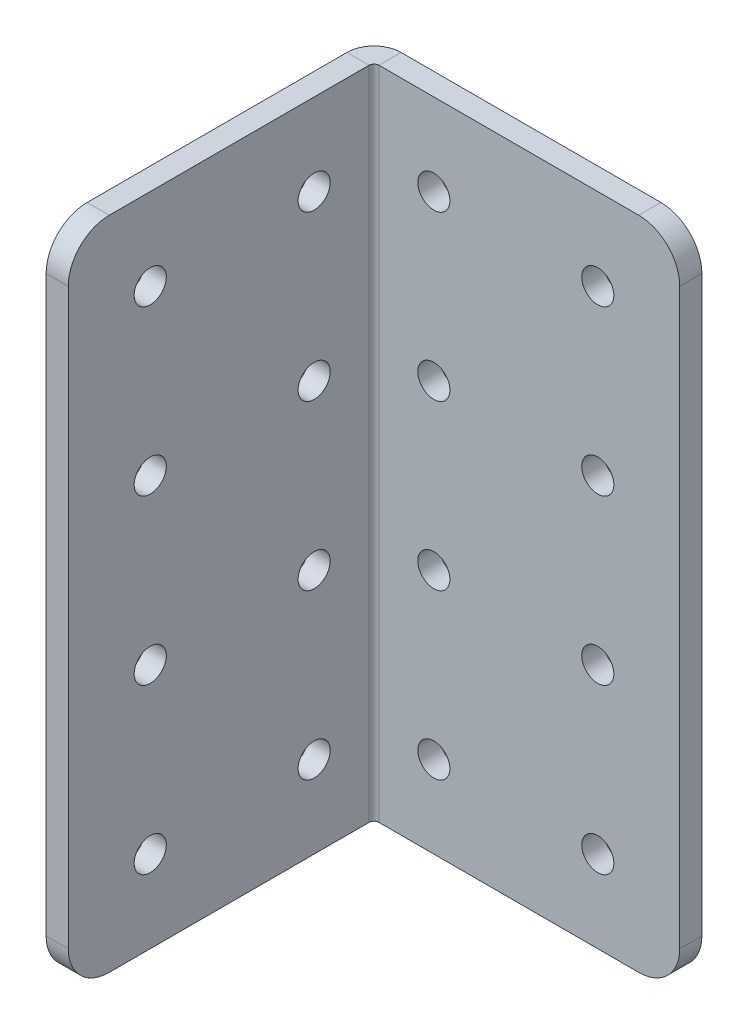
ISO-10303-21;
HEADER;
FILE_DESCRIPTION(('STEP AP214'),'2;1');
FILE_NAME('part.step','',(''),(''),'','','');
FILE_SCHEMA(('AUTOMOTIVE_DESIGN { 1 0 10303 214 1 1 1 1 }'));
ENDSEC;
DATA;
#1=APPLICATION_CONTEXT('core data for automotive mechanical design processes');
#2=APPLICATION_PROTOCOL_DEFINITION('international standard','automotive_design',2000,#1);
#3=PRODUCT_CONTEXT('',#1,'mechanical');
#4=PRODUCT('Part','Part','',(#3));
#5=PRODUCT_RELATED_PRODUCT_CATEGORY('part','',(#4));
#6=PRODUCT_DEFINITION_FORMATION('','',#4);
#7=PRODUCT_DEFINITION_CONTEXT('part definition',#1,'design');
#8=PRODUCT_DEFINITION('design','',#6,#7);
#9=PRODUCT_DEFINITION_SHAPE('','',#8);
#10=(LENGTH_UNIT() NAMED_UNIT(*) SI_UNIT(.MILLI.,.METRE.));
#11=(NAMED_UNIT(*) PLANE_ANGLE_UNIT() SI_UNIT($,.RADIAN.));
#12=(NAMED_UNIT(*) SI_UNIT($,.STERADIAN.) SOLID_ANGLE_UNIT());
#13=UNCERTAINTY_MEASURE_WITH_UNIT(LENGTH_MEASURE(1.E-05),#10,'distance_accuracy_value','');
#14=(GEOMETRIC_REPRESENTATION_CONTEXT(3) GLOBAL_UNCERTAINTY_ASSIGNED_CONTEXT((#13)) GLOBAL_UNIT_ASSIGNED_CONTEXT((#10,
#11,#12)) REPRESENTATION_CONTEXT('',''));
#15=CARTESIAN_POINT('',(0.,0.,0.));
#16=DIRECTION('',(0.,0.,1.));
#17=DIRECTION('',(1.,0.,0.));
#18=AXIS2_PLACEMENT_3D('',#15,#16,#17);
#19=CARTESIAN_POINT('',(4.191,101.6,0.));
#20=DIRECTION('',(0.,1.,0.));
#21=DIRECTION('',(0.,0.,1.));
#22=AXIS2_PLACEMENT_3D('',#19,#20,#21);
#23=PLANE('',#22);
#24=DIRECTION('',(0.,0.,1.));
#25=VECTOR('',#24,1.);
#26=CARTESIAN_POINT('',(4.191,101.6,0.));
#27=LINE('',#26,#25);
#28=CARTESIAN_POINT('',(4.191,101.6,0.));
#29=VERTEX_POINT('',#28);
#30=CARTESIAN_POINT('',(4.191,101.6,3.429));
#31=VERTEX_POINT('',#30);
#32=EDGE_CURVE('E136',#29,#31,#27,.T.);
#33=ORIENTED_EDGE('',*,*,#32,.F.);
#34=CARTESIAN_POINT('',(4.191,101.6,4.191));
#35=DIRECTION('',(0.,1.,0.));
#36=DIRECTION('',(0.,0.,1.));
#37=AXIS2_PLACEMENT_3D('',#34,#35,#36);
#38=CIRCLE('',#37,4.191);
#39=CARTESIAN_POINT('',(0.,101.6,4.191));
#40=VERTEX_POINT('',#39);
#41=EDGE_CURVE('E140',#40,#29,#38,.F.);
#42=ORIENTED_EDGE('',*,*,#41,.F.);
#43=DIRECTION('',(-1.,0.,0.));
#44=VECTOR('',#43,1.);
#45=CARTESIAN_POINT('',(3.429,101.6,4.191));
#46=LINE('',#45,#44);
#47=CARTESIAN_POINT('',(3.429,101.6,4.191));
#48=VERTEX_POINT('',#47);
#49=EDGE_CURVE('E145',#48,#40,#46,.T.);
#50=ORIENTED_EDGE('',*,*,#49,.F.);
#51=CARTESIAN_POINT('',(4.191,101.6,4.191));
#52=DIRECTION('',(0.,1.,0.));
#53=DIRECTION('',(1.,0.,0.));
#54=AXIS2_PLACEMENT_3D('',#51,#52,#53);
#55=CIRCLE('',#54,0.762);
#56=EDGE_CURVE('E142',#48,#31,#55,.F.);
#57=ORIENTED_EDGE('',*,*,#56,.T.);
#58=EDGE_LOOP('',(#33,#42,#50,#57));
#59=FACE_BOUND('',#58,.T.);
#60=ADVANCED_FACE('F45',(#59),#23,.T.);
#61=CARTESIAN_POINT('',(3.429,101.6,4.191));
#62=DIRECTION('',(0.,1.,0.));
#63=DIRECTION('',(0.,0.,1.));
#64=AXIS2_PLACEMENT_3D('',#61,#62,#63);
#65=PLANE('',#64);
#66=DIRECTION('',(1.,0.,0.));
#67=VECTOR('',#66,1.);
#68=CARTESIAN_POINT('',(0.,101.6,3.429));
#69=LINE('',#68,#67);
#70=CARTESIAN_POINT('',(44.45,101.6,3.429));
#71=VERTEX_POINT('',#70);
#72=EDGE_CURVE('E163',#31,#71,#69,.T.);
#73=ORIENTED_EDGE('',*,*,#72,.T.);
#74=DIRECTION('',(0.,0.,1.));
#75=VECTOR('',#74,1.);
#76=CARTESIAN_POINT('',(44.45,101.6,4.191));
#77=LINE('',#76,#75);
#78=CARTESIAN_POINT('',(44.45,101.6,0.));
#79=VERTEX_POINT('',#78);
#80=EDGE_CURVE('E53',#71,#79,#77,.F.);
#81=ORIENTED_EDGE('',*,*,#80,.T.);
#82=DIRECTION('',(1.,0.,0.));
#83=VECTOR('',#82,1.);
#84=CARTESIAN_POINT('',(0.,101.6,0.));
#85=LINE('',#84,#83);
#86=EDGE_CURVE('E152',#29,#79,#85,.T.);
#87=ORIENTED_EDGE('',*,*,#86,.F.);
#88=ORIENTED_EDGE('',*,*,#32,.T.);
#89=EDGE_LOOP('',(#73,#81,#87,#88));
#90=FACE_BOUND('',#89,.T.);
#91=ADVANCED_FACE('F162',(#90),#65,.T.);
#92=CARTESIAN_POINT('',(0.,0.,4.191));
#93=DIRECTION('',(0.,-1.,0.));
#94=DIRECTION('',(0.,0.,-1.));
#95=AXIS2_PLACEMENT_3D('',#92,#93,#94);
#96=PLANE('',#95);
#97=DIRECTION('',(1.,0.,0.));
#98=VECTOR('',#97,1.);
#99=CARTESIAN_POINT('',(0.,0.,4.191));
#100=LINE('',#99,#98);
#101=CARTESIAN_POINT('',(0.,0.,4.191));
#102=VERTEX_POINT('',#101);
#103=CARTESIAN_POINT('',(3.429,0.,4.191));
#104=VERTEX_POINT('',#103);
#105=EDGE_CURVE('E208',#102,#104,#100,.T.);
#106=ORIENTED_EDGE('',*,*,#105,.F.);
#107=CARTESIAN_POINT('',(4.191,0.,4.191));
#108=DIRECTION('',(0.,1.,0.));
#109=DIRECTION('',(0.,0.,1.));
#110=AXIS2_PLACEMENT_3D('',#107,#108,#109);
#111=CIRCLE('',#110,4.191);
#112=CARTESIAN_POINT('',(4.191,0.,0.));
#113=VERTEX_POINT('',#112);
#114=EDGE_CURVE('E182',#102,#113,#111,.F.);
#115=ORIENTED_EDGE('',*,*,#114,.T.);
#116=DIRECTION('',(0.,0.,-1.));
#117=VECTOR('',#116,1.);
#118=CARTESIAN_POINT('',(4.191,0.,3.429));
#119=LINE('',#118,#117);
#120=CARTESIAN_POINT('',(4.191,0.,3.429));
#121=VERTEX_POINT('',#120);
#122=EDGE_CURVE('E206',#121,#113,#119,.T.);
#123=ORIENTED_EDGE('',*,*,#122,.F.);
#124=CARTESIAN_POINT('',(4.191,0.,4.191));
#125=DIRECTION('',(0.,1.,0.));
#126=DIRECTION('',(1.,0.,0.));
#127=AXIS2_PLACEMENT_3D('',#124,#125,#126);
#128=CIRCLE('',#127,0.762);
#129=EDGE_CURVE('E188',#104,#121,#128,.F.);
#130=ORIENTED_EDGE('',*,*,#129,.F.);
#131=EDGE_LOOP('',(#106,#115,#123,#130));
#132=FACE_BOUND('',#131,.T.);
#133=ADVANCED_FACE('F379',(#132),#96,.T.);
#134=CARTESIAN_POINT('',(4.191,0.,3.429));
#135=DIRECTION('',(0.,-1.,0.));
#136=DIRECTION('',(0.,0.,-1.));
#137=AXIS2_PLACEMENT_3D('',#134,#135,#136);
#138=PLANE('',#137);
#139=DIRECTION('',(0.,0.,-1.));
#140=VECTOR('',#139,1.);
#141=CARTESIAN_POINT('',(3.429,0.,50.8));
#142=LINE('',#141,#140);
#143=CARTESIAN_POINT('',(3.429,0.,44.45));
#144=VERTEX_POINT('',#143);
#145=EDGE_CURVE('E186',#144,#104,#142,.T.);
#146=ORIENTED_EDGE('',*,*,#145,.F.);
#147=DIRECTION('',(-1.,0.,0.));
#148=VECTOR('',#147,1.);
#149=CARTESIAN_POINT('',(4.191,0.,44.45));
#150=LINE('',#149,#148);
#151=CARTESIAN_POINT('',(0.,0.,44.45));
#152=VERTEX_POINT('',#151);
#153=EDGE_CURVE('E144',#144,#152,#150,.T.);
#154=ORIENTED_EDGE('',*,*,#153,.T.);
#155=DIRECTION('',(0.,0.,-1.));
#156=VECTOR('',#155,1.);
#157=CARTESIAN_POINT('',(0.,0.,50.8));
#158=LINE('',#157,#156);
#159=EDGE_CURVE('E184',#152,#102,#158,.T.);
#160=ORIENTED_EDGE('',*,*,#159,.T.);
#161=ORIENTED_EDGE('',*,*,#105,.T.);
#162=EDGE_LOOP('',(#146,#154,#160,#161));
#163=FACE_BOUND('',#162,.T.);
#164=ADVANCED_FACE('F371',(#163),#138,.T.);
#165=CARTESIAN_POINT('',(0.,101.6,3.429));
#166=DIRECTION('',(0.,0.,-1.));
#167=DIRECTION('',(-1.,0.,0.));
#168=AXIS2_PLACEMENT_3D('',#165,#166,#167);
#169=PLANE('',#168);
#170=CARTESIAN_POINT('',(38.1,12.7,3.429));
#171=DIRECTION('',(0.,0.,-1.));
#172=DIRECTION('',(-1.,0.,0.));
#173=AXIS2_PLACEMENT_3D('',#170,#171,#172);
#174=CIRCLE('',#173,2.4892);
#175=CARTESIAN_POINT('',(35.6108,12.7,3.429));
#176=VERTEX_POINT('',#175);
#177=EDGE_CURVE('E289',#176,#176,#174,.T.);
#178=ORIENTED_EDGE('',*,*,#177,.T.);
#179=EDGE_LOOP('',(#178));
#180=FACE_BOUND('',#179,.T.);
#181=CARTESIAN_POINT('',(38.1,38.1,3.429));
#182=DIRECTION('',(0.,0.,-1.));
#183=DIRECTION('',(-1.,0.,0.));
#184=AXIS2_PLACEMENT_3D('',#181,#182,#183);
#185=CIRCLE('',#184,2.4892);
#186=CARTESIAN_POINT('',(35.6108,38.1,3.429));
#187=VERTEX_POINT('',#186);
#188=EDGE_CURVE('E308',#187,#187,#185,.T.);
#189=ORIENTED_EDGE('',*,*,#188,.T.);
#190=EDGE_LOOP('',(#189));
#191=FACE_BOUND('',#190,.T.);
#192=CARTESIAN_POINT('',(38.1,63.5,3.429));
#193=DIRECTION('',(0.,0.,-1.));
#194=DIRECTION('',(-1.,0.,0.));
#195=AXIS2_PLACEMENT_3D('',#192,#193,#194);
#196=CIRCLE('',#195,2.48919999999999);
#197=CARTESIAN_POINT('',(35.6108,63.5,3.429));
#198=VERTEX_POINT('',#197);
#199=EDGE_CURVE('E311',#198,#198,#196,.T.);
#200=ORIENTED_EDGE('',*,*,#199,.T.);
#201=EDGE_LOOP('',(#200));
#202=FACE_BOUND('',#201,.T.);
#203=CARTESIAN_POINT('',(12.7,12.7,3.429));
#204=DIRECTION('',(0.,0.,-1.));
#205=DIRECTION('',(-1.,0.,0.));
#206=AXIS2_PLACEMENT_3D('',#203,#204,#205);
#207=CIRCLE('',#206,2.4892);
#208=CARTESIAN_POINT('',(10.2108,12.7,3.429));
#209=VERTEX_POINT('',#208);
#210=EDGE_CURVE('E314',#209,#209,#207,.T.);
#211=ORIENTED_EDGE('',*,*,#210,.T.);
#212=EDGE_LOOP('',(#211));
#213=FACE_BOUND('',#212,.T.);
#214=CARTESIAN_POINT('',(12.7,38.1,3.429));
#215=DIRECTION('',(0.,0.,-1.));
#216=DIRECTION('',(-1.,0.,0.));
#217=AXIS2_PLACEMENT_3D('',#214,#215,#216);
#218=CIRCLE('',#217,2.4892);
#219=CARTESIAN_POINT('',(10.2108,38.1,3.429));
#220=VERTEX_POINT('',#219);
#221=EDGE_CURVE('E317',#220,#220,#218,.T.);
#222=ORIENTED_EDGE('',*,*,#221,.T.);
#223=EDGE_LOOP('',(#222));
#224=FACE_BOUND('',#223,.T.);
#225=CARTESIAN_POINT('',(12.7,63.5,3.429));
#226=DIRECTION('',(0.,0.,-1.));
#227=DIRECTION('',(-1.,0.,0.));
#228=AXIS2_PLACEMENT_3D('',#225,#226,#227);
#229=CIRCLE('',#228,2.48919999999999);
#230=CARTESIAN_POINT('',(10.2108,63.5,3.429));
#231=VERTEX_POINT('',#230);
#232=EDGE_CURVE('E320',#231,#231,#229,.T.);
#233=ORIENTED_EDGE('',*,*,#232,.T.);
#234=EDGE_LOOP('',(#233));
#235=FACE_BOUND('',#234,.T.);
#236=CARTESIAN_POINT('',(12.7,88.9,3.429));
#237=DIRECTION('',(0.,0.,-1.));
#238=DIRECTION('',(-1.,0.,0.));
#239=AXIS2_PLACEMENT_3D('',#236,#237,#238);
#240=CIRCLE('',#239,2.4892);
#241=CARTESIAN_POINT('',(10.2108,88.9,3.429));
#242=VERTEX_POINT('',#241);
#243=EDGE_CURVE('E323',#242,#242,#240,.T.);
#244=ORIENTED_EDGE('',*,*,#243,.T.);
#245=EDGE_LOOP('',(#244));
#246=FACE_BOUND('',#245,.T.);
#247=CARTESIAN_POINT('',(38.1,88.9,3.429));
#248=DIRECTION('',(0.,0.,-1.));
#249=DIRECTION('',(-1.,0.,0.));
#250=AXIS2_PLACEMENT_3D('',#247,#248,#249);
#251=CIRCLE('',#250,2.4892);
#252=CARTESIAN_POINT('',(35.6108,88.9,3.429));
#253=VERTEX_POINT('',#252);
#254=EDGE_CURVE('E326',#253,#253,#251,.T.);
#255=ORIENTED_EDGE('',*,*,#254,.T.);
#256=EDGE_LOOP('',(#255));
#257=FACE_BOUND('',#256,.T.);
#258=DIRECTION('',(1.,0.,0.));
#259=VECTOR('',#258,1.);
#260=CARTESIAN_POINT('',(0.,0.,3.429));
#261=LINE('',#260,#259);
#262=CARTESIAN_POINT('',(44.45,0.,3.429));
#263=VERTEX_POINT('',#262);
#264=EDGE_CURVE('E177',#121,#263,#261,.T.);
#265=ORIENTED_EDGE('',*,*,#264,.T.);
#266=CARTESIAN_POINT('',(44.45,6.35,3.429));
#267=DIRECTION('',(0.,0.,-1.));
#268=DIRECTION('',(-1.,0.,0.));
#269=AXIS2_PLACEMENT_3D('',#266,#267,#268);
#270=CIRCLE('',#269,6.35);
#271=CARTESIAN_POINT('',(50.8,6.34999999999999,3.429));
#272=VERTEX_POINT('',#271);
#273=EDGE_CURVE('E257',#263,#272,#270,.F.);
#274=ORIENTED_EDGE('',*,*,#273,.T.);
#275=DIRECTION('',(0.,-1.,0.));
#276=VECTOR('',#275,1.);
#277=CARTESIAN_POINT('',(50.8,101.6,3.429));
#278=LINE('',#277,#276);
#279=CARTESIAN_POINT('',(50.8,95.25,3.429));
#280=VERTEX_POINT('',#279);
#281=EDGE_CURVE('E204',#280,#272,#278,.T.);
#282=ORIENTED_EDGE('',*,*,#281,.F.);
#283=CARTESIAN_POINT('',(44.45,95.25,3.429));
#284=DIRECTION('',(0.,0.,-1.));
#285=DIRECTION('',(-1.,0.,0.));
#286=AXIS2_PLACEMENT_3D('',#283,#284,#285);
#287=CIRCLE('',#286,6.35);
#288=EDGE_CURVE('E255',#280,#71,#287,.F.);
#289=ORIENTED_EDGE('',*,*,#288,.T.);
#290=ORIENTED_EDGE('',*,*,#72,.F.);
#291=DIRECTION('',(0.,-1.,0.));
#292=VECTOR('',#291,1.);
#293=CARTESIAN_POINT('',(4.191,101.6,3.429));
#294=LINE('',#293,#292);
#295=EDGE_CURVE('E176',#31,#121,#294,.T.);
#296=ORIENTED_EDGE('',*,*,#295,.T.);
#297=EDGE_LOOP('',(#265,#274,#282,#289,#290,#296));
#298=FACE_BOUND('',#297,.T.);
#299=ADVANCED_FACE('F275',(#180,#191,#202,#213,#224,#235,#246,#257,#298),#169,.F.);
#300=CARTESIAN_POINT('',(50.8,101.6,0.));
#301=DIRECTION('',(1.,0.,0.));
#302=DIRECTION('',(0.,0.,-1.));
#303=AXIS2_PLACEMENT_3D('',#300,#301,#302);
#304=PLANE('',#303);
#305=ORIENTED_EDGE('',*,*,#281,.T.);
#306=DIRECTION('',(0.,0.,1.));
#307=VECTOR('',#306,1.);
#308=CARTESIAN_POINT('',(50.8,6.35,0.));
#309=LINE('',#308,#307);
#310=CARTESIAN_POINT('',(50.8,6.34999999999999,0.));
#311=VERTEX_POINT('',#310);
#312=EDGE_CURVE('E67',#272,#311,#309,.F.);
#313=ORIENTED_EDGE('',*,*,#312,.T.);
#314=DIRECTION('',(0.,-1.,0.));
#315=VECTOR('',#314,1.);
#316=CARTESIAN_POINT('',(50.8,101.6,0.));
#317=LINE('',#316,#315);
#318=CARTESIAN_POINT('',(50.8,95.25,0.));
#319=VERTEX_POINT('',#318);
#320=EDGE_CURVE('E159',#319,#311,#317,.T.);
#321=ORIENTED_EDGE('',*,*,#320,.F.);
#322=DIRECTION('',(0.,0.,1.));
#323=VECTOR('',#322,1.);
#324=CARTESIAN_POINT('',(50.8,95.25,0.));
#325=LINE('',#324,#323);
#326=EDGE_CURVE('E259',#319,#280,#325,.T.);
#327=ORIENTED_EDGE('',*,*,#326,.T.);
#328=EDGE_LOOP('',(#305,#313,#321,#327));
#329=FACE_BOUND('',#328,.T.);
#330=ADVANCED_FACE('F276',(#329),#304,.T.);
#331=CARTESIAN_POINT('',(0.,101.6,0.));
#332=DIRECTION('',(0.,0.,-1.));
#333=DIRECTION('',(-1.,0.,0.));
#334=AXIS2_PLACEMENT_3D('',#331,#332,#333);
#335=PLANE('',#334);
#336=CARTESIAN_POINT('',(38.1,12.7,0.));
#337=DIRECTION('',(0.,0.,-1.));
#338=DIRECTION('',(-1.,0.,0.));
#339=AXIS2_PLACEMENT_3D('',#336,#337,#338);
#340=CIRCLE('',#339,2.4892);
#341=CARTESIAN_POINT('',(35.6108,12.7,0.));
#342=VERTEX_POINT('',#341);
#343=EDGE_CURVE('E333',#342,#342,#340,.T.);
#344=ORIENTED_EDGE('',*,*,#343,.F.);
#345=EDGE_LOOP('',(#344));
#346=FACE_BOUND('',#345,.T.);
#347=CARTESIAN_POINT('',(38.1,38.1,0.));
#348=DIRECTION('',(0.,0.,-1.));
#349=DIRECTION('',(-1.,0.,0.));
#350=AXIS2_PLACEMENT_3D('',#347,#348,#349);
#351=CIRCLE('',#350,2.4892);
#352=CARTESIAN_POINT('',(35.6108,38.1,0.));
#353=VERTEX_POINT('',#352);
#354=EDGE_CURVE('E336',#353,#353,#351,.T.);
#355=ORIENTED_EDGE('',*,*,#354,.F.);
#356=EDGE_LOOP('',(#355));
#357=FACE_BOUND('',#356,.T.);
#358=CARTESIAN_POINT('',(38.1,63.5,0.));
#359=DIRECTION('',(0.,0.,-1.));
#360=DIRECTION('',(-1.,0.,0.));
#361=AXIS2_PLACEMENT_3D('',#358,#359,#360);
#362=CIRCLE('',#361,2.48919999999999);
#363=CARTESIAN_POINT('',(35.6108,63.5,0.));
#364=VERTEX_POINT('',#363);
#365=EDGE_CURVE('E339',#364,#364,#362,.T.);
#366=ORIENTED_EDGE('',*,*,#365,.F.);
#367=EDGE_LOOP('',(#366));
#368=FACE_BOUND('',#367,.T.);
#369=CARTESIAN_POINT('',(12.7,12.7,0.));
#370=DIRECTION('',(0.,0.,-1.));
#371=DIRECTION('',(-1.,0.,0.));
#372=AXIS2_PLACEMENT_3D('',#369,#370,#371);
#373=CIRCLE('',#372,2.4892);
#374=CARTESIAN_POINT('',(10.2108,12.7,0.));
#375=VERTEX_POINT('',#374);
#376=EDGE_CURVE('E342',#375,#375,#373,.T.);
#377=ORIENTED_EDGE('',*,*,#376,.F.);
#378=EDGE_LOOP('',(#377));
#379=FACE_BOUND('',#378,.T.);
#380=CARTESIAN_POINT('',(12.7,38.1,0.));
#381=DIRECTION('',(0.,0.,-1.));
#382=DIRECTION('',(-1.,0.,0.));
#383=AXIS2_PLACEMENT_3D('',#380,#381,#382);
#384=CIRCLE('',#383,2.4892);
#385=CARTESIAN_POINT('',(10.2108,38.1,0.));
#386=VERTEX_POINT('',#385);
#387=EDGE_CURVE('E345',#386,#386,#384,.T.);
#388=ORIENTED_EDGE('',*,*,#387,.F.);
#389=EDGE_LOOP('',(#388));
#390=FACE_BOUND('',#389,.T.);
#391=CARTESIAN_POINT('',(12.7,63.5,0.));
#392=DIRECTION('',(0.,0.,-1.));
#393=DIRECTION('',(-1.,0.,0.));
#394=AXIS2_PLACEMENT_3D('',#391,#392,#393);
#395=CIRCLE('',#394,2.48919999999999);
#396=CARTESIAN_POINT('',(10.2108,63.5,0.));
#397=VERTEX_POINT('',#396);
#398=EDGE_CURVE('E348',#397,#397,#395,.T.);
#399=ORIENTED_EDGE('',*,*,#398,.F.);
#400=EDGE_LOOP('',(#399));
#401=FACE_BOUND('',#400,.T.);
#402=CARTESIAN_POINT('',(12.7,88.9,0.));
#403=DIRECTION('',(0.,0.,-1.));
#404=DIRECTION('',(-1.,0.,0.));
#405=AXIS2_PLACEMENT_3D('',#402,#403,#404);
#406=CIRCLE('',#405,2.4892);
#407=CARTESIAN_POINT('',(10.2108,88.9,0.));
#408=VERTEX_POINT('',#407);
#409=EDGE_CURVE('E332',#408,#408,#406,.T.);
#410=ORIENTED_EDGE('',*,*,#409,.F.);
#411=EDGE_LOOP('',(#410));
#412=FACE_BOUND('',#411,.T.);
#413=CARTESIAN_POINT('',(38.1,88.9,0.));
#414=DIRECTION('',(0.,0.,-1.));
#415=DIRECTION('',(-1.,0.,0.));
#416=AXIS2_PLACEMENT_3D('',#413,#414,#415);
#417=CIRCLE('',#416,2.4892);
#418=CARTESIAN_POINT('',(35.6108,88.9,0.));
#419=VERTEX_POINT('',#418);
#420=EDGE_CURVE('E329',#419,#419,#417,.T.);
#421=ORIENTED_EDGE('',*,*,#420,.F.);
#422=EDGE_LOOP('',(#421));
#423=FACE_BOUND('',#422,.T.);
#424=ORIENTED_EDGE('',*,*,#320,.T.);
#425=CARTESIAN_POINT('',(44.45,6.35,0.));
#426=DIRECTION('',(0.,0.,-1.));
#427=DIRECTION('',(-1.,0.,0.));
#428=AXIS2_PLACEMENT_3D('',#425,#426,#427);
#429=CIRCLE('',#428,6.35);
#430=CARTESIAN_POINT('',(44.45,0.,0.));
#431=VERTEX_POINT('',#430);
#432=EDGE_CURVE('E265',#311,#431,#429,.T.);
#433=ORIENTED_EDGE('',*,*,#432,.T.);
#434=DIRECTION('',(1.,0.,0.));
#435=VECTOR('',#434,1.);
#436=CARTESIAN_POINT('',(0.,0.,0.));
#437=LINE('',#436,#435);
#438=EDGE_CURVE('E155',#113,#431,#437,.T.);
#439=ORIENTED_EDGE('',*,*,#438,.F.);
#440=DIRECTION('',(0.,-1.,0.));
#441=VECTOR('',#440,1.);
#442=CARTESIAN_POINT('',(4.191,101.6,0.));
#443=LINE('',#442,#441);
#444=EDGE_CURVE('E150',#29,#113,#443,.T.);
#445=ORIENTED_EDGE('',*,*,#444,.F.);
#446=ORIENTED_EDGE('',*,*,#86,.T.);
#447=CARTESIAN_POINT('',(44.45,95.25,0.));
#448=DIRECTION('',(0.,0.,-1.));
#449=DIRECTION('',(-1.,0.,0.));
#450=AXIS2_PLACEMENT_3D('',#447,#448,#449);
#451=CIRCLE('',#450,6.35);
#452=EDGE_CURVE('E263',#79,#319,#451,.T.);
#453=ORIENTED_EDGE('',*,*,#452,.T.);
#454=EDGE_LOOP('',(#424,#433,#439,#445,#446,#453));
#455=FACE_BOUND('',#454,.T.);
#456=ADVANCED_FACE('F151',(#346,#357,#368,#379,#390,#401,#412,#423,#455),#335,.T.);
#457=CARTESIAN_POINT('',(4.191,101.6,4.191));
#458=DIRECTION('',(0.,-1.,0.));
#459=DIRECTION('',(0.,0.,-1.));
#460=AXIS2_PLACEMENT_3D('',#457,#458,#459);
#461=CYLINDRICAL_SURFACE('',#460,4.191);
#462=ORIENTED_EDGE('',*,*,#114,.F.);
#463=DIRECTION('',(0.,-1.,0.));
#464=VECTOR('',#463,1.);
#465=CARTESIAN_POINT('',(0.,101.6,4.191));
#466=LINE('',#465,#464);
#467=EDGE_CURVE('E160',#40,#102,#466,.T.);
#468=ORIENTED_EDGE('',*,*,#467,.F.);
#469=ORIENTED_EDGE('',*,*,#41,.T.);
#470=ORIENTED_EDGE('',*,*,#444,.T.);
#471=EDGE_LOOP('',(#462,#468,#469,#470));
#472=FACE_BOUND('',#471,.T.);
#473=ADVANCED_FACE('F166',(#472),#461,.T.);
#474=CARTESIAN_POINT('',(0.,101.6,50.8));
#475=DIRECTION('',(-1.,0.,0.));
#476=DIRECTION('',(0.,0.,1.));
#477=AXIS2_PLACEMENT_3D('',#474,#475,#476);
#478=PLANE('',#477);
#479=CARTESIAN_POINT('',(0.,12.7,38.1));
#480=DIRECTION('',(-1.,0.,0.));
#481=DIRECTION('',(0.,0.,1.));
#482=AXIS2_PLACEMENT_3D('',#479,#480,#481);
#483=CIRCLE('',#482,2.4892);
#484=CARTESIAN_POINT('',(0.,12.7,40.5892));
#485=VERTEX_POINT('',#484);
#486=EDGE_CURVE('E285',#485,#485,#483,.T.);
#487=ORIENTED_EDGE('',*,*,#486,.F.);
#488=EDGE_LOOP('',(#487));
#489=FACE_BOUND('',#488,.T.);
#490=CARTESIAN_POINT('',(0.,38.1,38.1));
#491=DIRECTION('',(-1.,0.,0.));
#492=DIRECTION('',(0.,0.,1.));
#493=AXIS2_PLACEMENT_3D('',#490,#491,#492);
#494=CIRCLE('',#493,2.4892);
#495=CARTESIAN_POINT('',(0.,38.1,40.5892));
#496=VERTEX_POINT('',#495);
#497=EDGE_CURVE('E288',#496,#496,#494,.T.);
#498=ORIENTED_EDGE('',*,*,#497,.F.);
#499=EDGE_LOOP('',(#498));
#500=FACE_BOUND('',#499,.T.);
#501=CARTESIAN_POINT('',(0.,63.5,38.1));
#502=DIRECTION('',(-1.,0.,0.));
#503=DIRECTION('',(0.,0.,1.));
#504=AXIS2_PLACEMENT_3D('',#501,#502,#503);
#505=CIRCLE('',#504,2.48919999999999);
#506=CARTESIAN_POINT('',(0.,63.5,40.5892));
#507=VERTEX_POINT('',#506);
#508=EDGE_CURVE('E292',#507,#507,#505,.T.);
#509=ORIENTED_EDGE('',*,*,#508,.F.);
#510=EDGE_LOOP('',(#509));
#511=FACE_BOUND('',#510,.T.);
#512=CARTESIAN_POINT('',(0.,12.7,12.7));
#513=DIRECTION('',(-1.,0.,0.));
#514=DIRECTION('',(0.,0.,1.));
#515=AXIS2_PLACEMENT_3D('',#512,#513,#514);
#516=CIRCLE('',#515,2.4892);
#517=CARTESIAN_POINT('',(0.,12.7,15.1892));
#518=VERTEX_POINT('',#517);
#519=EDGE_CURVE('E295',#518,#518,#516,.T.);
#520=ORIENTED_EDGE('',*,*,#519,.F.);
#521=EDGE_LOOP('',(#520));
#522=FACE_BOUND('',#521,.T.);
#523=CARTESIAN_POINT('',(0.,38.1,12.7));
#524=DIRECTION('',(-1.,0.,0.));
#525=DIRECTION('',(0.,0.,1.));
#526=AXIS2_PLACEMENT_3D('',#523,#524,#525);
#527=CIRCLE('',#526,2.4892);
#528=CARTESIAN_POINT('',(0.,38.1,15.1892));
#529=VERTEX_POINT('',#528);
#530=EDGE_CURVE('E298',#529,#529,#527,.T.);
#531=ORIENTED_EDGE('',*,*,#530,.F.);
#532=EDGE_LOOP('',(#531));
#533=FACE_BOUND('',#532,.T.);
#534=CARTESIAN_POINT('',(0.,63.5,12.7));
#535=DIRECTION('',(-1.,0.,0.));
#536=DIRECTION('',(0.,0.,1.));
#537=AXIS2_PLACEMENT_3D('',#534,#535,#536);
#538=CIRCLE('',#537,2.48919999999999);
#539=CARTESIAN_POINT('',(0.,63.5,15.1892));
#540=VERTEX_POINT('',#539);
#541=EDGE_CURVE('E301',#540,#540,#538,.T.);
#542=ORIENTED_EDGE('',*,*,#541,.F.);
#543=EDGE_LOOP('',(#542));
#544=FACE_BOUND('',#543,.T.);
#545=CARTESIAN_POINT('',(0.,88.9,12.7));
#546=DIRECTION('',(-1.,0.,0.));
#547=DIRECTION('',(0.,0.,1.));
#548=AXIS2_PLACEMENT_3D('',#545,#546,#547);
#549=CIRCLE('',#548,2.4892);
#550=CARTESIAN_POINT('',(0.,88.9,15.1892));
#551=VERTEX_POINT('',#550);
#552=EDGE_CURVE('E284',#551,#551,#549,.T.);
#553=ORIENTED_EDGE('',*,*,#552,.F.);
#554=EDGE_LOOP('',(#553));
#555=FACE_BOUND('',#554,.T.);
#556=CARTESIAN_POINT('',(0.,88.9,38.1));
#557=DIRECTION('',(-1.,0.,0.));
#558=DIRECTION('',(0.,0.,1.));
#559=AXIS2_PLACEMENT_3D('',#556,#557,#558);
#560=CIRCLE('',#559,2.4892);
#561=CARTESIAN_POINT('',(0.,88.9,40.5892));
#562=VERTEX_POINT('',#561);
#563=EDGE_CURVE('E217',#562,#562,#560,.T.);
#564=ORIENTED_EDGE('',*,*,#563,.F.);
#565=EDGE_LOOP('',(#564));
#566=FACE_BOUND('',#565,.T.);
#567=ORIENTED_EDGE('',*,*,#159,.F.);
#568=CARTESIAN_POINT('',(0.,6.35,44.45));
#569=DIRECTION('',(-1.,0.,0.));
#570=DIRECTION('',(0.,0.,1.));
#571=AXIS2_PLACEMENT_3D('',#568,#569,#570);
#572=CIRCLE('',#571,6.35);
#573=CARTESIAN_POINT('',(0.,6.34999999999999,50.8));
#574=VERTEX_POINT('',#573);
#575=EDGE_CURVE('E241',#152,#574,#572,.T.);
#576=ORIENTED_EDGE('',*,*,#575,.T.);
#577=DIRECTION('',(0.,-1.,0.));
#578=VECTOR('',#577,1.);
#579=CARTESIAN_POINT('',(0.,101.6,50.8));
#580=LINE('',#579,#578);
#581=CARTESIAN_POINT('',(0.,95.25,50.8));
#582=VERTEX_POINT('',#581);
#583=EDGE_CURVE('E199',#582,#574,#580,.T.);
#584=ORIENTED_EDGE('',*,*,#583,.F.);
#585=CARTESIAN_POINT('',(0.,95.25,44.45));
#586=DIRECTION('',(-1.,0.,0.));
#587=DIRECTION('',(0.,0.,1.));
#588=AXIS2_PLACEMENT_3D('',#585,#586,#587);
#589=CIRCLE('',#588,6.35);
#590=CARTESIAN_POINT('',(0.,101.6,44.45));
#591=VERTEX_POINT('',#590);
#592=EDGE_CURVE('E239',#582,#591,#589,.T.);
#593=ORIENTED_EDGE('',*,*,#592,.T.);
#594=DIRECTION('',(0.,0.,-1.));
#595=VECTOR('',#594,1.);
#596=CARTESIAN_POINT('',(0.,101.6,50.8));
#597=LINE('',#596,#595);
#598=EDGE_CURVE('E168',#591,#40,#597,.T.);
#599=ORIENTED_EDGE('',*,*,#598,.T.);
#600=ORIENTED_EDGE('',*,*,#467,.T.);
#601=EDGE_LOOP('',(#567,#576,#584,#593,#599,#600));
#602=FACE_BOUND('',#601,.T.);
#603=ADVANCED_FACE('F437',(#489,#500,#511,#522,#533,#544,#555,#566,#602),#478,.T.);
#604=CARTESIAN_POINT('',(3.429,101.6,50.8));
#605=DIRECTION('',(0.,0.,1.));
#606=DIRECTION('',(1.,0.,0.));
#607=AXIS2_PLACEMENT_3D('',#604,#605,#606);
#608=PLANE('',#607);
#609=ORIENTED_EDGE('',*,*,#583,.T.);
#610=DIRECTION('',(-1.,0.,0.));
#611=VECTOR('',#610,1.);
#612=CARTESIAN_POINT('',(3.429,6.34999999999999,50.8));
#613=LINE('',#612,#611);
#614=CARTESIAN_POINT('',(3.429,6.34999999999999,50.8));
#615=VERTEX_POINT('',#614);
#616=EDGE_CURVE('E246',#574,#615,#613,.F.);
#617=ORIENTED_EDGE('',*,*,#616,.T.);
#618=DIRECTION('',(0.,-1.,0.));
#619=VECTOR('',#618,1.);
#620=CARTESIAN_POINT('',(3.429,101.6,50.8));
#621=LINE('',#620,#619);
#622=CARTESIAN_POINT('',(3.429,95.25,50.8));
#623=VERTEX_POINT('',#622);
#624=EDGE_CURVE('E196',#623,#615,#621,.T.);
#625=ORIENTED_EDGE('',*,*,#624,.F.);
#626=DIRECTION('',(-1.,0.,0.));
#627=VECTOR('',#626,1.);
#628=CARTESIAN_POINT('',(3.429,95.25,50.8));
#629=LINE('',#628,#627);
#630=EDGE_CURVE('E243',#623,#582,#629,.T.);
#631=ORIENTED_EDGE('',*,*,#630,.T.);
#632=EDGE_LOOP('',(#609,#617,#625,#631));
#633=FACE_BOUND('',#632,.T.);
#634=ADVANCED_FACE('F415',(#633),#608,.T.);
#635=CARTESIAN_POINT('',(3.429,101.6,50.8));
#636=DIRECTION('',(-1.,0.,0.));
#637=DIRECTION('',(0.,0.,1.));
#638=AXIS2_PLACEMENT_3D('',#635,#636,#637);
#639=PLANE('',#638);
#640=CARTESIAN_POINT('',(3.429,12.7,38.1));
#641=DIRECTION('',(-1.,0.,0.));
#642=DIRECTION('',(0.,0.,1.));
#643=AXIS2_PLACEMENT_3D('',#640,#641,#642);
#644=CIRCLE('',#643,2.4892);
#645=CARTESIAN_POINT('',(3.429,12.7,40.5892));
#646=VERTEX_POINT('',#645);
#647=EDGE_CURVE('E180',#646,#646,#644,.T.);
#648=ORIENTED_EDGE('',*,*,#647,.T.);
#649=EDGE_LOOP('',(#648));
#650=FACE_BOUND('',#649,.T.);
#651=CARTESIAN_POINT('',(3.429,38.1,38.1));
#652=DIRECTION('',(-1.,0.,0.));
#653=DIRECTION('',(0.,0.,1.));
#654=AXIS2_PLACEMENT_3D('',#651,#652,#653);
#655=CIRCLE('',#654,2.4892);
#656=CARTESIAN_POINT('',(3.429,38.1,40.5892));
#657=VERTEX_POINT('',#656);
#658=EDGE_CURVE('E232',#657,#657,#655,.T.);
#659=ORIENTED_EDGE('',*,*,#658,.T.);
#660=EDGE_LOOP('',(#659));
#661=FACE_BOUND('',#660,.T.);
#662=CARTESIAN_POINT('',(3.429,63.5,38.1));
#663=DIRECTION('',(-1.,0.,0.));
#664=DIRECTION('',(0.,0.,1.));
#665=AXIS2_PLACEMENT_3D('',#662,#663,#664);
#666=CIRCLE('',#665,2.48919999999999);
#667=CARTESIAN_POINT('',(3.429,63.5,40.5892));
#668=VERTEX_POINT('',#667);
#669=EDGE_CURVE('E229',#668,#668,#666,.T.);
#670=ORIENTED_EDGE('',*,*,#669,.T.);
#671=EDGE_LOOP('',(#670));
#672=FACE_BOUND('',#671,.T.);
#673=CARTESIAN_POINT('',(3.429,12.7,12.7));
#674=DIRECTION('',(-1.,0.,0.));
#675=DIRECTION('',(0.,0.,1.));
#676=AXIS2_PLACEMENT_3D('',#673,#674,#675);
#677=CIRCLE('',#676,2.4892);
#678=CARTESIAN_POINT('',(3.429,12.7,15.1892));
#679=VERTEX_POINT('',#678);
#680=EDGE_CURVE('E226',#679,#679,#677,.T.);
#681=ORIENTED_EDGE('',*,*,#680,.T.);
#682=EDGE_LOOP('',(#681));
#683=FACE_BOUND('',#682,.T.);
#684=CARTESIAN_POINT('',(3.429,38.1,12.7));
#685=DIRECTION('',(-1.,0.,0.));
#686=DIRECTION('',(0.,0.,1.));
#687=AXIS2_PLACEMENT_3D('',#684,#685,#686);
#688=CIRCLE('',#687,2.4892);
#689=CARTESIAN_POINT('',(3.429,38.1,15.1892));
#690=VERTEX_POINT('',#689);
#691=EDGE_CURVE('E223',#690,#690,#688,.T.);
#692=ORIENTED_EDGE('',*,*,#691,.T.);
#693=EDGE_LOOP('',(#692));
#694=FACE_BOUND('',#693,.T.);
#695=CARTESIAN_POINT('',(3.429,63.5,12.7));
#696=DIRECTION('',(-1.,0.,0.));
#697=DIRECTION('',(0.,0.,1.));
#698=AXIS2_PLACEMENT_3D('',#695,#696,#697);
#699=CIRCLE('',#698,2.48919999999999);
#700=CARTESIAN_POINT('',(3.429,63.5,15.1892));
#701=VERTEX_POINT('',#700);
#702=EDGE_CURVE('E220',#701,#701,#699,.T.);
#703=ORIENTED_EDGE('',*,*,#702,.T.);
#704=EDGE_LOOP('',(#703));
#705=FACE_BOUND('',#704,.T.);
#706=CARTESIAN_POINT('',(3.429,88.9,12.7));
#707=DIRECTION('',(-1.,0.,0.));
#708=DIRECTION('',(0.,0.,1.));
#709=AXIS2_PLACEMENT_3D('',#706,#707,#708);
#710=CIRCLE('',#709,2.4892);
#711=CARTESIAN_POINT('',(3.429,88.9,15.1892));
#712=VERTEX_POINT('',#711);
#713=EDGE_CURVE('E216',#712,#712,#710,.T.);
#714=ORIENTED_EDGE('',*,*,#713,.T.);
#715=EDGE_LOOP('',(#714));
#716=FACE_BOUND('',#715,.T.);
#717=CARTESIAN_POINT('',(3.429,88.9,38.1));
#718=DIRECTION('',(-1.,0.,0.));
#719=DIRECTION('',(0.,0.,1.));
#720=AXIS2_PLACEMENT_3D('',#717,#718,#719);
#721=CIRCLE('',#720,2.4892);
#722=CARTESIAN_POINT('',(3.429,88.9,40.5892));
#723=VERTEX_POINT('',#722);
#724=EDGE_CURVE('E213',#723,#723,#721,.T.);
#725=ORIENTED_EDGE('',*,*,#724,.T.);
#726=EDGE_LOOP('',(#725));
#727=FACE_BOUND('',#726,.T.);
#728=ORIENTED_EDGE('',*,*,#624,.T.);
#729=CARTESIAN_POINT('',(3.429,6.35,44.45));
#730=DIRECTION('',(-1.,0.,0.));
#731=DIRECTION('',(0.,0.,1.));
#732=AXIS2_PLACEMENT_3D('',#729,#730,#731);
#733=CIRCLE('',#732,6.35);
#734=EDGE_CURVE('E250',#615,#144,#733,.F.);
#735=ORIENTED_EDGE('',*,*,#734,.T.);
#736=ORIENTED_EDGE('',*,*,#145,.T.);
#737=DIRECTION('',(0.,-1.,0.));
#738=VECTOR('',#737,1.);
#739=CARTESIAN_POINT('',(3.429,101.6,4.191));
#740=LINE('',#739,#738);
#741=EDGE_CURVE('E193',#48,#104,#740,.T.);
#742=ORIENTED_EDGE('',*,*,#741,.F.);
#743=DIRECTION('',(0.,0.,-1.));
#744=VECTOR('',#743,1.);
#745=CARTESIAN_POINT('',(3.429,101.6,50.8));
#746=LINE('',#745,#744);
#747=CARTESIAN_POINT('',(3.429,101.6,44.45));
#748=VERTEX_POINT('',#747);
#749=EDGE_CURVE('E170',#748,#48,#746,.T.);
#750=ORIENTED_EDGE('',*,*,#749,.F.);
#751=CARTESIAN_POINT('',(3.429,95.25,44.45));
#752=DIRECTION('',(-1.,0.,0.));
#753=DIRECTION('',(0.,0.,1.));
#754=AXIS2_PLACEMENT_3D('',#751,#752,#753);
#755=CIRCLE('',#754,6.35);
#756=EDGE_CURVE('E248',#748,#623,#755,.F.);
#757=ORIENTED_EDGE('',*,*,#756,.T.);
#758=EDGE_LOOP('',(#728,#735,#736,#742,#750,#757));
#759=FACE_BOUND('',#758,.T.);
#760=ADVANCED_FACE('F411',(#650,#661,#672,#683,#694,#705,#716,#727,#759),#639,.F.);
#761=CARTESIAN_POINT('',(4.191,101.6,4.191));
#762=DIRECTION('',(0.,-1.,0.));
#763=DIRECTION('',(0.,0.,-1.));
#764=AXIS2_PLACEMENT_3D('',#761,#762,#763);
#765=CYLINDRICAL_SURFACE('',#764,0.762);
#766=ORIENTED_EDGE('',*,*,#129,.T.);
#767=ORIENTED_EDGE('',*,*,#295,.F.);
#768=ORIENTED_EDGE('',*,*,#56,.F.);
#769=ORIENTED_EDGE('',*,*,#741,.T.);
#770=EDGE_LOOP('',(#766,#767,#768,#769));
#771=FACE_BOUND('',#770,.T.);
#772=ADVANCED_FACE('F425',(#771),#765,.F.);
#773=CARTESIAN_POINT('',(4.191,101.6,4.191));
#774=DIRECTION('',(0.,1.,0.));
#775=DIRECTION('',(1.,0.,0.));
#776=AXIS2_PLACEMENT_3D('',#773,#774,#775);
#777=PLANE('',#776);
#778=ORIENTED_EDGE('',*,*,#598,.F.);
#779=DIRECTION('',(-1.,0.,0.));
#780=VECTOR('',#779,1.);
#781=CARTESIAN_POINT('',(4.191,101.6,44.45));
#782=LINE('',#781,#780);
#783=EDGE_CURVE('E11',#591,#748,#782,.F.);
#784=ORIENTED_EDGE('',*,*,#783,.T.);
#785=ORIENTED_EDGE('',*,*,#749,.T.);
#786=ORIENTED_EDGE('',*,*,#49,.T.);
#787=EDGE_LOOP('',(#778,#784,#785,#786));
#788=FACE_BOUND('',#787,.T.);
#789=ADVANCED_FACE('F447',(#788),#777,.T.);
#790=CARTESIAN_POINT('',(4.191,0.,4.191));
#791=DIRECTION('',(0.,1.,0.));
#792=DIRECTION('',(1.,0.,0.));
#793=AXIS2_PLACEMENT_3D('',#790,#791,#792);
#794=PLANE('',#793);
#795=ORIENTED_EDGE('',*,*,#438,.T.);
#796=DIRECTION('',(0.,0.,1.));
#797=VECTOR('',#796,1.);
#798=CARTESIAN_POINT('',(44.45,0.,3.429));
#799=LINE('',#798,#797);
#800=EDGE_CURVE('E252',#431,#263,#799,.T.);
#801=ORIENTED_EDGE('',*,*,#800,.T.);
#802=ORIENTED_EDGE('',*,*,#264,.F.);
#803=ORIENTED_EDGE('',*,*,#122,.T.);
#804=EDGE_LOOP('',(#795,#801,#802,#803));
#805=FACE_BOUND('',#804,.T.);
#806=ADVANCED_FACE('F270',(#805),#794,.F.);
#807=CARTESIAN_POINT('',(50.8,88.9,38.1));
#808=DIRECTION('',(-1.,0.,0.));
#809=DIRECTION('',(0.,0.,1.));
#810=AXIS2_PLACEMENT_3D('',#807,#808,#809);
#811=CYLINDRICAL_SURFACE('',#810,2.4892);
#812=ORIENTED_EDGE('',*,*,#563,.T.);
#813=EDGE_LOOP('',(#812));
#814=FACE_BOUND('',#813,.T.);
#815=ORIENTED_EDGE('',*,*,#724,.F.);
#816=EDGE_LOOP('',(#815));
#817=FACE_BOUND('',#816,.T.);
#818=ADVANCED_FACE('F454',(#814,#817),#811,.F.);
#819=CARTESIAN_POINT('',(50.8,88.9,12.7));
#820=DIRECTION('',(-1.,0.,0.));
#821=DIRECTION('',(0.,0.,1.));
#822=AXIS2_PLACEMENT_3D('',#819,#820,#821);
#823=CYLINDRICAL_SURFACE('',#822,2.4892);
#824=ORIENTED_EDGE('',*,*,#552,.T.);
#825=EDGE_LOOP('',(#824));
#826=FACE_BOUND('',#825,.T.);
#827=ORIENTED_EDGE('',*,*,#713,.F.);
#828=EDGE_LOOP('',(#827));
#829=FACE_BOUND('',#828,.T.);
#830=ADVANCED_FACE('F458',(#826,#829),#823,.F.);
#831=CARTESIAN_POINT('',(50.8,63.5,12.7));
#832=DIRECTION('',(-1.,0.,0.));
#833=DIRECTION('',(0.,0.,1.));
#834=AXIS2_PLACEMENT_3D('',#831,#832,#833);
#835=CYLINDRICAL_SURFACE('',#834,2.48919999999999);
#836=ORIENTED_EDGE('',*,*,#541,.T.);
#837=EDGE_LOOP('',(#836));
#838=FACE_BOUND('',#837,.T.);
#839=ORIENTED_EDGE('',*,*,#702,.F.);
#840=EDGE_LOOP('',(#839));
#841=FACE_BOUND('',#840,.T.);
#842=ADVANCED_FACE('F468',(#838,#841),#835,.F.);
#843=CARTESIAN_POINT('',(50.8,38.1,12.7));
#844=DIRECTION('',(-1.,0.,0.));
#845=DIRECTION('',(0.,0.,1.));
#846=AXIS2_PLACEMENT_3D('',#843,#844,#845);
#847=CYLINDRICAL_SURFACE('',#846,2.4892);
#848=ORIENTED_EDGE('',*,*,#530,.T.);
#849=EDGE_LOOP('',(#848));
#850=FACE_BOUND('',#849,.T.);
#851=ORIENTED_EDGE('',*,*,#691,.F.);
#852=EDGE_LOOP('',(#851));
#853=FACE_BOUND('',#852,.T.);
#854=ADVANCED_FACE('F477',(#850,#853),#847,.F.);
#855=CARTESIAN_POINT('',(50.8,12.7,12.7));
#856=DIRECTION('',(-1.,0.,0.));
#857=DIRECTION('',(0.,0.,1.));
#858=AXIS2_PLACEMENT_3D('',#855,#856,#857);
#859=CYLINDRICAL_SURFACE('',#858,2.4892);
#860=ORIENTED_EDGE('',*,*,#519,.T.);
#861=EDGE_LOOP('',(#860));
#862=FACE_BOUND('',#861,.T.);
#863=ORIENTED_EDGE('',*,*,#680,.F.);
#864=EDGE_LOOP('',(#863));
#865=FACE_BOUND('',#864,.T.);
#866=ADVANCED_FACE('F486',(#862,#865),#859,.F.);
#867=CARTESIAN_POINT('',(50.8,63.5,38.1));
#868=DIRECTION('',(-1.,0.,0.));
#869=DIRECTION('',(0.,0.,1.));
#870=AXIS2_PLACEMENT_3D('',#867,#868,#869);
#871=CYLINDRICAL_SURFACE('',#870,2.48919999999999);
#872=ORIENTED_EDGE('',*,*,#508,.T.);
#873=EDGE_LOOP('',(#872));
#874=FACE_BOUND('',#873,.T.);
#875=ORIENTED_EDGE('',*,*,#669,.F.);
#876=EDGE_LOOP('',(#875));
#877=FACE_BOUND('',#876,.T.);
#878=ADVANCED_FACE('F495',(#874,#877),#871,.F.);
#879=CARTESIAN_POINT('',(50.8,38.1,38.1));
#880=DIRECTION('',(-1.,0.,0.));
#881=DIRECTION('',(0.,0.,1.));
#882=AXIS2_PLACEMENT_3D('',#879,#880,#881);
#883=CYLINDRICAL_SURFACE('',#882,2.4892);
#884=ORIENTED_EDGE('',*,*,#497,.T.);
#885=EDGE_LOOP('',(#884));
#886=FACE_BOUND('',#885,.T.);
#887=ORIENTED_EDGE('',*,*,#658,.F.);
#888=EDGE_LOOP('',(#887));
#889=FACE_BOUND('',#888,.T.);
#890=ADVANCED_FACE('F504',(#886,#889),#883,.F.);
#891=CARTESIAN_POINT('',(50.8,12.7,38.1));
#892=DIRECTION('',(-1.,0.,0.));
#893=DIRECTION('',(0.,0.,1.));
#894=AXIS2_PLACEMENT_3D('',#891,#892,#893);
#895=CYLINDRICAL_SURFACE('',#894,2.4892);
#896=ORIENTED_EDGE('',*,*,#486,.T.);
#897=EDGE_LOOP('',(#896));
#898=FACE_BOUND('',#897,.T.);
#899=ORIENTED_EDGE('',*,*,#647,.F.);
#900=EDGE_LOOP('',(#899));
#901=FACE_BOUND('',#900,.T.);
#902=ADVANCED_FACE('F366',(#898,#901),#895,.F.);
#903=CARTESIAN_POINT('',(38.1,88.9,50.8));
#904=DIRECTION('',(0.,0.,-1.));
#905=DIRECTION('',(-1.,0.,0.));
#906=AXIS2_PLACEMENT_3D('',#903,#904,#905);
#907=CYLINDRICAL_SURFACE('',#906,2.4892);
#908=ORIENTED_EDGE('',*,*,#420,.T.);
#909=EDGE_LOOP('',(#908));
#910=FACE_BOUND('',#909,.T.);
#911=ORIENTED_EDGE('',*,*,#254,.F.);
#912=EDGE_LOOP('',(#911));
#913=FACE_BOUND('',#912,.T.);
#914=ADVANCED_FACE('F363',(#910,#913),#907,.F.);
#915=CARTESIAN_POINT('',(12.7,88.9,50.8));
#916=DIRECTION('',(0.,0.,-1.));
#917=DIRECTION('',(-1.,0.,0.));
#918=AXIS2_PLACEMENT_3D('',#915,#916,#917);
#919=CYLINDRICAL_SURFACE('',#918,2.4892);
#920=ORIENTED_EDGE('',*,*,#409,.T.);
#921=EDGE_LOOP('',(#920));
#922=FACE_BOUND('',#921,.T.);
#923=ORIENTED_EDGE('',*,*,#243,.F.);
#924=EDGE_LOOP('',(#923));
#925=FACE_BOUND('',#924,.T.);
#926=ADVANCED_FACE('F354',(#922,#925),#919,.F.);
#927=CARTESIAN_POINT('',(12.7,63.5,50.8));
#928=DIRECTION('',(0.,0.,-1.));
#929=DIRECTION('',(-1.,0.,0.));
#930=AXIS2_PLACEMENT_3D('',#927,#928,#929);
#931=CYLINDRICAL_SURFACE('',#930,2.48919999999999);
#932=ORIENTED_EDGE('',*,*,#398,.T.);
#933=EDGE_LOOP('',(#932));
#934=FACE_BOUND('',#933,.T.);
#935=ORIENTED_EDGE('',*,*,#232,.F.);
#936=EDGE_LOOP('',(#935));
#937=FACE_BOUND('',#936,.T.);
#938=ADVANCED_FACE('F534',(#934,#937),#931,.F.);
#939=CARTESIAN_POINT('',(12.7,38.1,50.8));
#940=DIRECTION('',(0.,0.,-1.));
#941=DIRECTION('',(-1.,0.,0.));
#942=AXIS2_PLACEMENT_3D('',#939,#940,#941);
#943=CYLINDRICAL_SURFACE('',#942,2.4892);
#944=ORIENTED_EDGE('',*,*,#387,.T.);
#945=EDGE_LOOP('',(#944));
#946=FACE_BOUND('',#945,.T.);
#947=ORIENTED_EDGE('',*,*,#221,.F.);
#948=EDGE_LOOP('',(#947));
#949=FACE_BOUND('',#948,.T.);
#950=ADVANCED_FACE('F542',(#946,#949),#943,.F.);
#951=CARTESIAN_POINT('',(12.7,12.7,50.8));
#952=DIRECTION('',(0.,0.,-1.));
#953=DIRECTION('',(-1.,0.,0.));
#954=AXIS2_PLACEMENT_3D('',#951,#952,#953);
#955=CYLINDRICAL_SURFACE('',#954,2.4892);
#956=ORIENTED_EDGE('',*,*,#376,.T.);
#957=EDGE_LOOP('',(#956));
#958=FACE_BOUND('',#957,.T.);
#959=ORIENTED_EDGE('',*,*,#210,.F.);
#960=EDGE_LOOP('',(#959));
#961=FACE_BOUND('',#960,.T.);
#962=ADVANCED_FACE('F551',(#958,#961),#955,.F.);
#963=CARTESIAN_POINT('',(38.1,63.5,50.8));
#964=DIRECTION('',(0.,0.,-1.));
#965=DIRECTION('',(-1.,0.,0.));
#966=AXIS2_PLACEMENT_3D('',#963,#964,#965);
#967=CYLINDRICAL_SURFACE('',#966,2.48919999999999);
#968=ORIENTED_EDGE('',*,*,#365,.T.);
#969=EDGE_LOOP('',(#968));
#970=FACE_BOUND('',#969,.T.);
#971=ORIENTED_EDGE('',*,*,#199,.F.);
#972=EDGE_LOOP('',(#971));
#973=FACE_BOUND('',#972,.T.);
#974=ADVANCED_FACE('F560',(#970,#973),#967,.F.);
#975=CARTESIAN_POINT('',(38.1,38.1,50.8));
#976=DIRECTION('',(0.,0.,-1.));
#977=DIRECTION('',(-1.,0.,0.));
#978=AXIS2_PLACEMENT_3D('',#975,#976,#977);
#979=CYLINDRICAL_SURFACE('',#978,2.4892);
#980=ORIENTED_EDGE('',*,*,#354,.T.);
#981=EDGE_LOOP('',(#980));
#982=FACE_BOUND('',#981,.T.);
#983=ORIENTED_EDGE('',*,*,#188,.F.);
#984=EDGE_LOOP('',(#983));
#985=FACE_BOUND('',#984,.T.);
#986=ADVANCED_FACE('F569',(#982,#985),#979,.F.);
#987=CARTESIAN_POINT('',(38.1,12.7,50.8));
#988=DIRECTION('',(0.,0.,-1.));
#989=DIRECTION('',(-1.,0.,0.));
#990=AXIS2_PLACEMENT_3D('',#987,#988,#989);
#991=CYLINDRICAL_SURFACE('',#990,2.4892);
#992=ORIENTED_EDGE('',*,*,#343,.T.);
#993=EDGE_LOOP('',(#992));
#994=FACE_BOUND('',#993,.T.);
#995=ORIENTED_EDGE('',*,*,#177,.F.);
#996=EDGE_LOOP('',(#995));
#997=FACE_BOUND('',#996,.T.);
#998=ADVANCED_FACE('F395',(#994,#997),#991,.F.);
#999=CARTESIAN_POINT('',(4.191,6.35,44.45));
#1000=DIRECTION('',(-1.,0.,0.));
#1001=DIRECTION('',(0.,0.,1.));
#1002=AXIS2_PLACEMENT_3D('',#999,#1000,#1001);
#1003=CYLINDRICAL_SURFACE('',#1002,6.35);
#1004=ORIENTED_EDGE('',*,*,#734,.F.);
#1005=ORIENTED_EDGE('',*,*,#616,.F.);
#1006=ORIENTED_EDGE('',*,*,#575,.F.);
#1007=ORIENTED_EDGE('',*,*,#153,.F.);
#1008=EDGE_LOOP('',(#1004,#1005,#1006,#1007));
#1009=FACE_BOUND('',#1008,.T.);
#1010=ADVANCED_FACE('F392',(#1009),#1003,.T.);
#1011=CARTESIAN_POINT('',(44.45,6.35,4.191));
#1012=DIRECTION('',(0.,0.,-1.));
#1013=DIRECTION('',(-1.,0.,0.));
#1014=AXIS2_PLACEMENT_3D('',#1011,#1012,#1013);
#1015=CYLINDRICAL_SURFACE('',#1014,6.35);
#1016=ORIENTED_EDGE('',*,*,#432,.F.);
#1017=ORIENTED_EDGE('',*,*,#312,.F.);
#1018=ORIENTED_EDGE('',*,*,#273,.F.);
#1019=ORIENTED_EDGE('',*,*,#800,.F.);
#1020=EDGE_LOOP('',(#1016,#1017,#1018,#1019));
#1021=FACE_BOUND('',#1020,.T.);
#1022=ADVANCED_FACE('F272',(#1021),#1015,.T.);
#1023=CARTESIAN_POINT('',(44.45,95.25,0.));
#1024=DIRECTION('',(0.,0.,1.));
#1025=DIRECTION('',(1.,0.,0.));
#1026=AXIS2_PLACEMENT_3D('',#1023,#1024,#1025);
#1027=CYLINDRICAL_SURFACE('',#1026,6.35);
#1028=ORIENTED_EDGE('',*,*,#452,.F.);
#1029=ORIENTED_EDGE('',*,*,#80,.F.);
#1030=ORIENTED_EDGE('',*,*,#288,.F.);
#1031=ORIENTED_EDGE('',*,*,#326,.F.);
#1032=EDGE_LOOP('',(#1028,#1029,#1030,#1031));
#1033=FACE_BOUND('',#1032,.T.);
#1034=ADVANCED_FACE('F279',(#1033),#1027,.T.);
#1035=CARTESIAN_POINT('',(3.429,95.25,44.45));
#1036=DIRECTION('',(-1.,0.,0.));
#1037=DIRECTION('',(0.,0.,1.));
#1038=AXIS2_PLACEMENT_3D('',#1035,#1036,#1037);
#1039=CYLINDRICAL_SURFACE('',#1038,6.35);
#1040=ORIENTED_EDGE('',*,*,#756,.F.);
#1041=ORIENTED_EDGE('',*,*,#783,.F.);
#1042=ORIENTED_EDGE('',*,*,#592,.F.);
#1043=ORIENTED_EDGE('',*,*,#630,.F.);
#1044=EDGE_LOOP('',(#1040,#1041,#1042,#1043));
#1045=FACE_BOUND('',#1044,.T.);
#1046=ADVANCED_FACE('F47',(#1045),#1039,.T.);
#1047=CLOSED_SHELL('',(#60,#91,#133,#164,#299,#330,#456,#473,#603,#634,#760,#772,#789,#806,#818,
#830,#842,#854,#866,#878,#890,#902,#914,#926,#938,#950,#962,#974,#986,#998,#1010,#1022,#1034,#1046));
#1048=MANIFOLD_SOLID_BREP('B2',#1047);
#1049=ADVANCED_BREP_SHAPE_REPRESENTATION('',(#18,#1048),#14);
#1050=SHAPE_DEFINITION_REPRESENTATION(#9,#1049);
ENDSEC;
END-ISO-10303-21;
